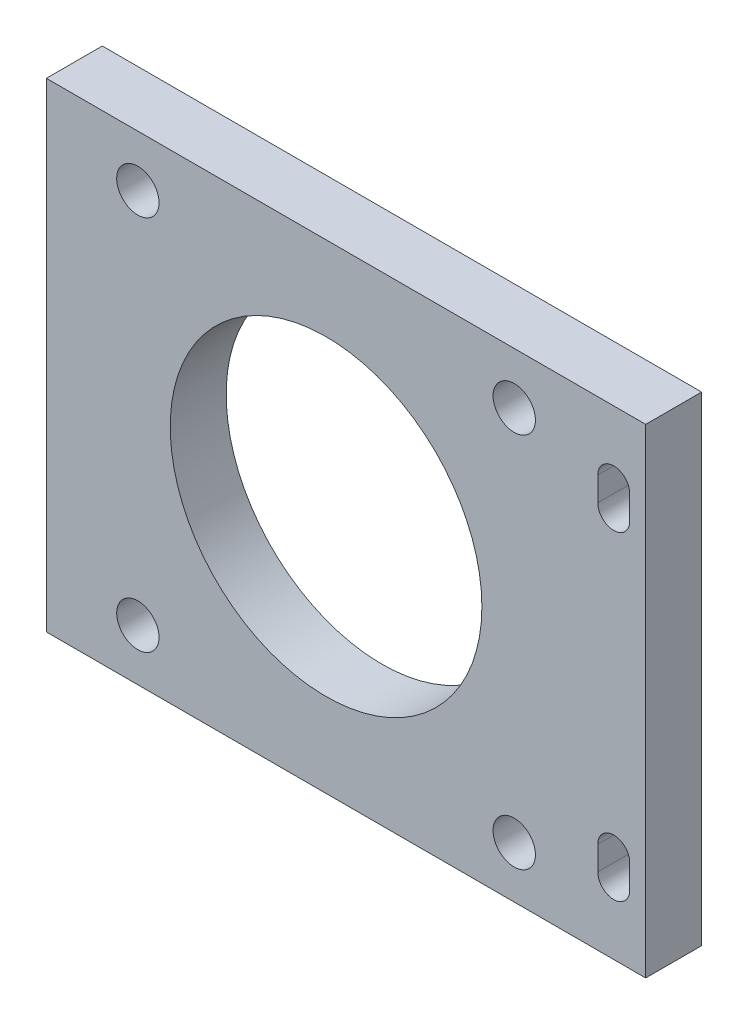
ISO-10303-21;
HEADER;
FILE_DESCRIPTION(('STEP AP214'),'2;1');
FILE_NAME('part.step','',(''),(''),'','','');
FILE_SCHEMA(('AUTOMOTIVE_DESIGN { 1 0 10303 214 1 1 1 1 }'));
ENDSEC;
DATA;
#1=APPLICATION_CONTEXT('core data for automotive mechanical design processes');
#2=APPLICATION_PROTOCOL_DEFINITION('international standard','automotive_design',2000,#1);
#3=PRODUCT_CONTEXT('',#1,'mechanical');
#4=PRODUCT('Part','Part','',(#3));
#5=PRODUCT_RELATED_PRODUCT_CATEGORY('part','',(#4));
#6=PRODUCT_DEFINITION_FORMATION('','',#4);
#7=PRODUCT_DEFINITION_CONTEXT('part definition',#1,'design');
#8=PRODUCT_DEFINITION('design','',#6,#7);
#9=PRODUCT_DEFINITION_SHAPE('','',#8);
#10=(LENGTH_UNIT() NAMED_UNIT(*) SI_UNIT(.MILLI.,.METRE.));
#11=(NAMED_UNIT(*) PLANE_ANGLE_UNIT() SI_UNIT($,.RADIAN.));
#12=(NAMED_UNIT(*) SI_UNIT($,.STERADIAN.) SOLID_ANGLE_UNIT());
#13=UNCERTAINTY_MEASURE_WITH_UNIT(LENGTH_MEASURE(1.E-05),#10,'distance_accuracy_value','');
#14=(GEOMETRIC_REPRESENTATION_CONTEXT(3) GLOBAL_UNCERTAINTY_ASSIGNED_CONTEXT((#13)) GLOBAL_UNIT_ASSIGNED_CONTEXT((#10,
#11,#12)) REPRESENTATION_CONTEXT('',''));
#15=CARTESIAN_POINT('',(0.,0.,0.));
#16=DIRECTION('',(0.,0.,1.));
#17=DIRECTION('',(1.,0.,0.));
#18=AXIS2_PLACEMENT_3D('',#15,#16,#17);
#19=CARTESIAN_POINT('',(-37.5,-30.,7.));
#20=DIRECTION('',(1.,0.,0.));
#21=DIRECTION('',(0.,0.,-1.));
#22=AXIS2_PLACEMENT_3D('',#19,#20,#21);
#23=PLANE('',#22);
#24=DIRECTION('',(0.,-1.,0.));
#25=VECTOR('',#24,1.);
#26=CARTESIAN_POINT('',(-37.5,-30.,0.));
#27=LINE('',#26,#25);
#28=CARTESIAN_POINT('',(-37.5,30.,0.));
#29=VERTEX_POINT('',#28);
#30=CARTESIAN_POINT('',(-37.5,-30.,0.));
#31=VERTEX_POINT('',#30);
#32=EDGE_CURVE('E219',#29,#31,#27,.T.);
#33=ORIENTED_EDGE('',*,*,#32,.T.);
#34=DIRECTION('',(0.,0.,-1.));
#35=VECTOR('',#34,1.);
#36=CARTESIAN_POINT('',(-37.5,-30.,7.));
#37=LINE('',#36,#35);
#38=CARTESIAN_POINT('',(-37.5,-30.,7.));
#39=VERTEX_POINT('',#38);
#40=EDGE_CURVE('E11',#39,#31,#37,.T.);
#41=ORIENTED_EDGE('',*,*,#40,.F.);
#42=DIRECTION('',(0.,-1.,0.));
#43=VECTOR('',#42,1.);
#44=CARTESIAN_POINT('',(-37.5,-30.,7.));
#45=LINE('',#44,#43);
#46=CARTESIAN_POINT('',(-37.5,30.,7.));
#47=VERTEX_POINT('',#46);
#48=EDGE_CURVE('E220',#47,#39,#45,.T.);
#49=ORIENTED_EDGE('',*,*,#48,.F.);
#50=DIRECTION('',(0.,0.,-1.));
#51=VECTOR('',#50,1.);
#52=CARTESIAN_POINT('',(-37.5,30.,7.));
#53=LINE('',#52,#51);
#54=EDGE_CURVE('E230',#47,#29,#53,.T.);
#55=ORIENTED_EDGE('',*,*,#54,.T.);
#56=EDGE_LOOP('',(#33,#41,#49,#55));
#57=FACE_BOUND('',#56,.T.);
#58=ADVANCED_FACE('F33',(#57),#23,.F.);
#59=CARTESIAN_POINT('',(37.5,-30.,7.));
#60=DIRECTION('',(0.,1.,0.));
#61=DIRECTION('',(-1.,0.,0.));
#62=AXIS2_PLACEMENT_3D('',#59,#60,#61);
#63=PLANE('',#62);
#64=DIRECTION('',(1.,0.,0.));
#65=VECTOR('',#64,1.);
#66=CARTESIAN_POINT('',(37.5,-30.,0.));
#67=LINE('',#66,#65);
#68=CARTESIAN_POINT('',(37.5,-30.,0.));
#69=VERTEX_POINT('',#68);
#70=EDGE_CURVE('E233',#31,#69,#67,.T.);
#71=ORIENTED_EDGE('',*,*,#70,.T.);
#72=DIRECTION('',(0.,0.,-1.));
#73=VECTOR('',#72,1.);
#74=CARTESIAN_POINT('',(37.5,-30.,7.));
#75=LINE('',#74,#73);
#76=CARTESIAN_POINT('',(37.5,-30.,7.));
#77=VERTEX_POINT('',#76);
#78=EDGE_CURVE('E40',#77,#69,#75,.T.);
#79=ORIENTED_EDGE('',*,*,#78,.F.);
#80=DIRECTION('',(1.,0.,0.));
#81=VECTOR('',#80,1.);
#82=CARTESIAN_POINT('',(37.5,-30.,7.));
#83=LINE('',#82,#81);
#84=EDGE_CURVE('E223',#39,#77,#83,.T.);
#85=ORIENTED_EDGE('',*,*,#84,.F.);
#86=ORIENTED_EDGE('',*,*,#40,.T.);
#87=EDGE_LOOP('',(#71,#79,#85,#86));
#88=FACE_BOUND('',#87,.T.);
#89=ADVANCED_FACE('F262',(#88),#63,.F.);
#90=CARTESIAN_POINT('',(37.5,-30.,7.));
#91=DIRECTION('',(-1.,0.,0.));
#92=DIRECTION('',(0.,0.,1.));
#93=AXIS2_PLACEMENT_3D('',#90,#91,#92);
#94=PLANE('',#93);
#95=DIRECTION('',(0.,1.,0.));
#96=VECTOR('',#95,1.);
#97=CARTESIAN_POINT('',(37.5,-30.,0.));
#98=LINE('',#97,#96);
#99=CARTESIAN_POINT('',(37.5,30.,0.));
#100=VERTEX_POINT('',#99);
#101=EDGE_CURVE('E235',#69,#100,#98,.T.);
#102=ORIENTED_EDGE('',*,*,#101,.T.);
#103=DIRECTION('',(0.,0.,-1.));
#104=VECTOR('',#103,1.);
#105=CARTESIAN_POINT('',(37.5,30.,7.));
#106=LINE('',#105,#104);
#107=CARTESIAN_POINT('',(37.5,30.,7.));
#108=VERTEX_POINT('',#107);
#109=EDGE_CURVE('E240',#108,#100,#106,.T.);
#110=ORIENTED_EDGE('',*,*,#109,.F.);
#111=DIRECTION('',(0.,1.,0.));
#112=VECTOR('',#111,1.);
#113=CARTESIAN_POINT('',(37.5,-30.,7.));
#114=LINE('',#113,#112);
#115=EDGE_CURVE('E226',#77,#108,#114,.T.);
#116=ORIENTED_EDGE('',*,*,#115,.F.);
#117=ORIENTED_EDGE('',*,*,#78,.T.);
#118=EDGE_LOOP('',(#102,#110,#116,#117));
#119=FACE_BOUND('',#118,.T.);
#120=ADVANCED_FACE('F247',(#119),#94,.F.);
#121=CARTESIAN_POINT('',(37.5,30.,7.));
#122=DIRECTION('',(0.,-1.,0.));
#123=DIRECTION('',(1.,0.,0.));
#124=AXIS2_PLACEMENT_3D('',#121,#122,#123);
#125=PLANE('',#124);
#126=DIRECTION('',(-1.,0.,0.));
#127=VECTOR('',#126,1.);
#128=CARTESIAN_POINT('',(37.5,30.,0.));
#129=LINE('',#128,#127);
#130=EDGE_CURVE('E224',#100,#29,#129,.T.);
#131=ORIENTED_EDGE('',*,*,#130,.T.);
#132=ORIENTED_EDGE('',*,*,#54,.F.);
#133=DIRECTION('',(-1.,0.,0.));
#134=VECTOR('',#133,1.);
#135=CARTESIAN_POINT('',(37.5,30.,7.));
#136=LINE('',#135,#134);
#137=EDGE_CURVE('E228',#108,#47,#136,.T.);
#138=ORIENTED_EDGE('',*,*,#137,.F.);
#139=ORIENTED_EDGE('',*,*,#109,.T.);
#140=EDGE_LOOP('',(#131,#132,#138,#139));
#141=FACE_BOUND('',#140,.T.);
#142=ADVANCED_FACE('F256',(#141),#125,.F.);
#143=CARTESIAN_POINT('',(0.,0.,7.));
#144=DIRECTION('',(0.,0.,1.));
#145=DIRECTION('',(1.,0.,0.));
#146=AXIS2_PLACEMENT_3D('',#143,#144,#145);
#147=PLANE('',#146);
#148=CARTESIAN_POINT('',(33.5,-18.5,7.));
#149=DIRECTION('',(0.,0.,-1.));
#150=DIRECTION('',(1.,0.,0.));
#151=AXIS2_PLACEMENT_3D('',#148,#149,#150);
#152=CIRCLE('',#151,2.);
#153=CARTESIAN_POINT('',(31.5,-18.5,7.));
#154=VERTEX_POINT('',#153);
#155=CARTESIAN_POINT('',(35.5,-18.5,7.));
#156=VERTEX_POINT('',#155);
#157=EDGE_CURVE('E123',#154,#156,#152,.T.);
#158=ORIENTED_EDGE('',*,*,#157,.T.);
#159=DIRECTION('',(0.,-1.,0.));
#160=VECTOR('',#159,1.);
#161=CARTESIAN_POINT('',(35.5,-18.5,7.));
#162=LINE('',#161,#160);
#163=CARTESIAN_POINT('',(35.5,-21.5,7.));
#164=VERTEX_POINT('',#163);
#165=EDGE_CURVE('E132',#156,#164,#162,.T.);
#166=ORIENTED_EDGE('',*,*,#165,.T.);
#167=CARTESIAN_POINT('',(33.5,-21.5,7.));
#168=DIRECTION('',(0.,0.,-1.));
#169=DIRECTION('',(1.,0.,0.));
#170=AXIS2_PLACEMENT_3D('',#167,#168,#169);
#171=CIRCLE('',#170,2.);
#172=CARTESIAN_POINT('',(31.5,-21.5,7.));
#173=VERTEX_POINT('',#172);
#174=EDGE_CURVE('E47',#164,#173,#171,.T.);
#175=ORIENTED_EDGE('',*,*,#174,.T.);
#176=DIRECTION('',(0.,1.,0.));
#177=VECTOR('',#176,1.);
#178=CARTESIAN_POINT('',(31.5,-18.5,7.));
#179=LINE('',#178,#177);
#180=EDGE_CURVE('E129',#173,#154,#179,.T.);
#181=ORIENTED_EDGE('',*,*,#180,.T.);
#182=EDGE_LOOP('',(#158,#166,#175,#181));
#183=FACE_BOUND('',#182,.T.);
#184=CARTESIAN_POINT('',(33.5,18.5,7.));
#185=DIRECTION('',(0.,0.,-1.));
#186=DIRECTION('',(-1.,0.,0.));
#187=AXIS2_PLACEMENT_3D('',#184,#185,#186);
#188=CIRCLE('',#187,2.);
#189=CARTESIAN_POINT('',(35.5,18.5,7.));
#190=VERTEX_POINT('',#189);
#191=CARTESIAN_POINT('',(31.5,18.5,7.));
#192=VERTEX_POINT('',#191);
#193=EDGE_CURVE('E158',#190,#192,#188,.T.);
#194=ORIENTED_EDGE('',*,*,#193,.T.);
#195=DIRECTION('',(0.,1.,0.));
#196=VECTOR('',#195,1.);
#197=CARTESIAN_POINT('',(31.5,18.5,7.));
#198=LINE('',#197,#196);
#199=CARTESIAN_POINT('',(31.5,21.5,7.));
#200=VERTEX_POINT('',#199);
#201=EDGE_CURVE('E161',#192,#200,#198,.T.);
#202=ORIENTED_EDGE('',*,*,#201,.T.);
#203=CARTESIAN_POINT('',(33.5,21.5,7.));
#204=DIRECTION('',(0.,0.,-1.));
#205=DIRECTION('',(-1.,0.,0.));
#206=AXIS2_PLACEMENT_3D('',#203,#204,#205);
#207=CIRCLE('',#206,2.);
#208=CARTESIAN_POINT('',(35.5,21.5,7.));
#209=VERTEX_POINT('',#208);
#210=EDGE_CURVE('E165',#200,#209,#207,.T.);
#211=ORIENTED_EDGE('',*,*,#210,.T.);
#212=DIRECTION('',(0.,-1.,0.));
#213=VECTOR('',#212,1.);
#214=CARTESIAN_POINT('',(35.5,18.5,7.));
#215=LINE('',#214,#213);
#216=EDGE_CURVE('E168',#209,#190,#215,.T.);
#217=ORIENTED_EDGE('',*,*,#216,.T.);
#218=EDGE_LOOP('',(#194,#202,#211,#217));
#219=FACE_BOUND('',#218,.T.);
#220=CARTESIAN_POINT('',(-2.5,0.,7.));
#221=DIRECTION('',(0.,0.,1.));
#222=DIRECTION('',(1.,0.,0.));
#223=AXIS2_PLACEMENT_3D('',#220,#221,#222);
#224=CIRCLE('',#223,19.5);
#225=CARTESIAN_POINT('',(17.,0.,7.));
#226=VERTEX_POINT('',#225);
#227=EDGE_CURVE('E183',#226,#226,#224,.T.);
#228=ORIENTED_EDGE('',*,*,#227,.F.);
#229=EDGE_LOOP('',(#228));
#230=FACE_BOUND('',#229,.T.);
#231=CARTESIAN_POINT('',(21.05,23.55,7.));
#232=DIRECTION('',(0.,0.,-1.));
#233=DIRECTION('',(-1.,0.,0.));
#234=AXIS2_PLACEMENT_3D('',#231,#232,#233);
#235=CIRCLE('',#234,2.65);
#236=CARTESIAN_POINT('',(18.4,23.55,7.));
#237=VERTEX_POINT('',#236);
#238=EDGE_CURVE('E198',#237,#237,#235,.T.);
#239=ORIENTED_EDGE('',*,*,#238,.T.);
#240=EDGE_LOOP('',(#239));
#241=FACE_BOUND('',#240,.T.);
#242=CARTESIAN_POINT('',(-26.05,23.55,7.));
#243=DIRECTION('',(0.,0.,-1.));
#244=DIRECTION('',(-1.,0.,0.));
#245=AXIS2_PLACEMENT_3D('',#242,#243,#244);
#246=CIRCLE('',#245,2.65);
#247=CARTESIAN_POINT('',(-28.7,23.55,7.));
#248=VERTEX_POINT('',#247);
#249=EDGE_CURVE('E204',#248,#248,#246,.T.);
#250=ORIENTED_EDGE('',*,*,#249,.T.);
#251=EDGE_LOOP('',(#250));
#252=FACE_BOUND('',#251,.T.);
#253=CARTESIAN_POINT('',(-26.05,-23.55,7.));
#254=DIRECTION('',(0.,0.,-1.));
#255=DIRECTION('',(-1.,0.,0.));
#256=AXIS2_PLACEMENT_3D('',#253,#254,#255);
#257=CIRCLE('',#256,2.65);
#258=CARTESIAN_POINT('',(-28.7,-23.55,7.));
#259=VERTEX_POINT('',#258);
#260=EDGE_CURVE('E210',#259,#259,#257,.T.);
#261=ORIENTED_EDGE('',*,*,#260,.T.);
#262=EDGE_LOOP('',(#261));
#263=FACE_BOUND('',#262,.T.);
#264=CARTESIAN_POINT('',(21.05,-23.55,7.));
#265=DIRECTION('',(0.,0.,-1.));
#266=DIRECTION('',(-1.,0.,0.));
#267=AXIS2_PLACEMENT_3D('',#264,#265,#266);
#268=CIRCLE('',#267,2.65);
#269=CARTESIAN_POINT('',(18.4,-23.55,7.));
#270=VERTEX_POINT('',#269);
#271=EDGE_CURVE('E216',#270,#270,#268,.T.);
#272=ORIENTED_EDGE('',*,*,#271,.T.);
#273=EDGE_LOOP('',(#272));
#274=FACE_BOUND('',#273,.T.);
#275=ORIENTED_EDGE('',*,*,#48,.T.);
#276=ORIENTED_EDGE('',*,*,#84,.T.);
#277=ORIENTED_EDGE('',*,*,#115,.T.);
#278=ORIENTED_EDGE('',*,*,#137,.T.);
#279=EDGE_LOOP('',(#275,#276,#277,#278));
#280=FACE_BOUND('',#279,.T.);
#281=ADVANCED_FACE('F136',(#183,#219,#230,#241,#252,#263,#274,#280),#147,.T.);
#282=CARTESIAN_POINT('',(0.,0.,0.));
#283=DIRECTION('',(0.,0.,1.));
#284=DIRECTION('',(1.,0.,0.));
#285=AXIS2_PLACEMENT_3D('',#282,#283,#284);
#286=PLANE('',#285);
#287=DIRECTION('',(0.,-1.,0.));
#288=VECTOR('',#287,1.);
#289=CARTESIAN_POINT('',(35.5,-18.5,0.));
#290=LINE('',#289,#288);
#291=CARTESIAN_POINT('',(35.5,-18.5,0.));
#292=VERTEX_POINT('',#291);
#293=CARTESIAN_POINT('',(35.5,-21.5,0.));
#294=VERTEX_POINT('',#293);
#295=EDGE_CURVE('E148',#292,#294,#290,.T.);
#296=ORIENTED_EDGE('',*,*,#295,.F.);
#297=CARTESIAN_POINT('',(33.5,-18.5,0.));
#298=DIRECTION('',(0.,0.,-1.));
#299=DIRECTION('',(1.,0.,0.));
#300=AXIS2_PLACEMENT_3D('',#297,#298,#299);
#301=CIRCLE('',#300,2.);
#302=CARTESIAN_POINT('',(31.5,-18.5,0.));
#303=VERTEX_POINT('',#302);
#304=EDGE_CURVE('E55',#303,#292,#301,.T.);
#305=ORIENTED_EDGE('',*,*,#304,.F.);
#306=DIRECTION('',(0.,1.,0.));
#307=VECTOR('',#306,1.);
#308=CARTESIAN_POINT('',(31.5,-18.5,0.));
#309=LINE('',#308,#307);
#310=CARTESIAN_POINT('',(31.5,-21.5,0.));
#311=VERTEX_POINT('',#310);
#312=EDGE_CURVE('E139',#311,#303,#309,.T.);
#313=ORIENTED_EDGE('',*,*,#312,.F.);
#314=CARTESIAN_POINT('',(33.5,-21.5,0.));
#315=DIRECTION('',(0.,0.,-1.));
#316=DIRECTION('',(1.,0.,0.));
#317=AXIS2_PLACEMENT_3D('',#314,#315,#316);
#318=CIRCLE('',#317,2.);
#319=EDGE_CURVE('E142',#294,#311,#318,.T.);
#320=ORIENTED_EDGE('',*,*,#319,.F.);
#321=EDGE_LOOP('',(#296,#305,#313,#320));
#322=FACE_BOUND('',#321,.T.);
#323=DIRECTION('',(0.,1.,0.));
#324=VECTOR('',#323,1.);
#325=CARTESIAN_POINT('',(31.5,18.5,0.));
#326=LINE('',#325,#324);
#327=CARTESIAN_POINT('',(31.5,18.5,0.));
#328=VERTEX_POINT('',#327);
#329=CARTESIAN_POINT('',(31.5,21.5,0.));
#330=VERTEX_POINT('',#329);
#331=EDGE_CURVE('E173',#328,#330,#326,.T.);
#332=ORIENTED_EDGE('',*,*,#331,.F.);
#333=CARTESIAN_POINT('',(33.5,18.5,0.));
#334=DIRECTION('',(0.,0.,-1.));
#335=DIRECTION('',(-1.,0.,0.));
#336=AXIS2_PLACEMENT_3D('',#333,#334,#335);
#337=CIRCLE('',#336,2.);
#338=CARTESIAN_POINT('',(35.5,18.5,0.));
#339=VERTEX_POINT('',#338);
#340=EDGE_CURVE('E154',#339,#328,#337,.T.);
#341=ORIENTED_EDGE('',*,*,#340,.F.);
#342=DIRECTION('',(0.,-1.,0.));
#343=VECTOR('',#342,1.);
#344=CARTESIAN_POINT('',(35.5,18.5,0.));
#345=LINE('',#344,#343);
#346=CARTESIAN_POINT('',(35.5,21.5,0.));
#347=VERTEX_POINT('',#346);
#348=EDGE_CURVE('E162',#347,#339,#345,.T.);
#349=ORIENTED_EDGE('',*,*,#348,.F.);
#350=CARTESIAN_POINT('',(33.5,21.5,0.));
#351=DIRECTION('',(0.,0.,-1.));
#352=DIRECTION('',(-1.,0.,0.));
#353=AXIS2_PLACEMENT_3D('',#350,#351,#352);
#354=CIRCLE('',#353,2.);
#355=EDGE_CURVE('E176',#330,#347,#354,.T.);
#356=ORIENTED_EDGE('',*,*,#355,.F.);
#357=EDGE_LOOP('',(#332,#341,#349,#356));
#358=FACE_BOUND('',#357,.T.);
#359=CARTESIAN_POINT('',(-2.5,0.,0.));
#360=DIRECTION('',(0.,0.,1.));
#361=DIRECTION('',(1.,0.,0.));
#362=AXIS2_PLACEMENT_3D('',#359,#360,#361);
#363=CIRCLE('',#362,19.5);
#364=CARTESIAN_POINT('',(17.,0.,0.));
#365=VERTEX_POINT('',#364);
#366=EDGE_CURVE('E190',#365,#365,#363,.T.);
#367=ORIENTED_EDGE('',*,*,#366,.T.);
#368=EDGE_LOOP('',(#367));
#369=FACE_BOUND('',#368,.T.);
#370=CARTESIAN_POINT('',(21.05,23.55,0.));
#371=DIRECTION('',(0.,0.,-1.));
#372=DIRECTION('',(-1.,0.,0.));
#373=AXIS2_PLACEMENT_3D('',#370,#371,#372);
#374=CIRCLE('',#373,2.65);
#375=CARTESIAN_POINT('',(18.4,23.55,0.));
#376=VERTEX_POINT('',#375);
#377=EDGE_CURVE('E193',#376,#376,#374,.T.);
#378=ORIENTED_EDGE('',*,*,#377,.F.);
#379=EDGE_LOOP('',(#378));
#380=FACE_BOUND('',#379,.T.);
#381=CARTESIAN_POINT('',(-26.05,23.55,0.));
#382=DIRECTION('',(0.,0.,-1.));
#383=DIRECTION('',(-1.,0.,0.));
#384=AXIS2_PLACEMENT_3D('',#381,#382,#383);
#385=CIRCLE('',#384,2.65);
#386=CARTESIAN_POINT('',(-28.7,23.55,0.));
#387=VERTEX_POINT('',#386);
#388=EDGE_CURVE('E201',#387,#387,#385,.T.);
#389=ORIENTED_EDGE('',*,*,#388,.F.);
#390=EDGE_LOOP('',(#389));
#391=FACE_BOUND('',#390,.T.);
#392=CARTESIAN_POINT('',(-26.05,-23.55,0.));
#393=DIRECTION('',(0.,0.,-1.));
#394=DIRECTION('',(-1.,0.,0.));
#395=AXIS2_PLACEMENT_3D('',#392,#393,#394);
#396=CIRCLE('',#395,2.65);
#397=CARTESIAN_POINT('',(-28.7,-23.55,0.));
#398=VERTEX_POINT('',#397);
#399=EDGE_CURVE('E207',#398,#398,#396,.T.);
#400=ORIENTED_EDGE('',*,*,#399,.F.);
#401=EDGE_LOOP('',(#400));
#402=FACE_BOUND('',#401,.T.);
#403=CARTESIAN_POINT('',(21.05,-23.55,0.));
#404=DIRECTION('',(0.,0.,-1.));
#405=DIRECTION('',(-1.,0.,0.));
#406=AXIS2_PLACEMENT_3D('',#403,#404,#405);
#407=CIRCLE('',#406,2.65);
#408=CARTESIAN_POINT('',(18.4,-23.55,0.));
#409=VERTEX_POINT('',#408);
#410=EDGE_CURVE('E213',#409,#409,#407,.T.);
#411=ORIENTED_EDGE('',*,*,#410,.F.);
#412=EDGE_LOOP('',(#411));
#413=FACE_BOUND('',#412,.T.);
#414=ORIENTED_EDGE('',*,*,#32,.F.);
#415=ORIENTED_EDGE('',*,*,#130,.F.);
#416=ORIENTED_EDGE('',*,*,#101,.F.);
#417=ORIENTED_EDGE('',*,*,#70,.F.);
#418=EDGE_LOOP('',(#414,#415,#416,#417));
#419=FACE_BOUND('',#418,.T.);
#420=ADVANCED_FACE('F253',(#322,#358,#369,#380,#391,#402,#413,#419),#286,.F.);
#421=CARTESIAN_POINT('',(21.05,-23.55,0.));
#422=DIRECTION('',(0.,0.,-1.));
#423=DIRECTION('',(-1.,0.,0.));
#424=AXIS2_PLACEMENT_3D('',#421,#422,#423);
#425=CYLINDRICAL_SURFACE('',#424,2.65);
#426=ORIENTED_EDGE('',*,*,#271,.F.);
#427=EDGE_LOOP('',(#426));
#428=FACE_BOUND('',#427,.T.);
#429=ORIENTED_EDGE('',*,*,#410,.T.);
#430=EDGE_LOOP('',(#429));
#431=FACE_BOUND('',#430,.T.);
#432=ADVANCED_FACE('F274',(#428,#431),#425,.F.);
#433=CARTESIAN_POINT('',(-26.05,-23.55,0.));
#434=DIRECTION('',(0.,0.,-1.));
#435=DIRECTION('',(-1.,0.,0.));
#436=AXIS2_PLACEMENT_3D('',#433,#434,#435);
#437=CYLINDRICAL_SURFACE('',#436,2.65);
#438=ORIENTED_EDGE('',*,*,#260,.F.);
#439=EDGE_LOOP('',(#438));
#440=FACE_BOUND('',#439,.T.);
#441=ORIENTED_EDGE('',*,*,#399,.T.);
#442=EDGE_LOOP('',(#441));
#443=FACE_BOUND('',#442,.T.);
#444=ADVANCED_FACE('F280',(#440,#443),#437,.F.);
#445=CARTESIAN_POINT('',(-26.05,23.55,0.));
#446=DIRECTION('',(0.,0.,-1.));
#447=DIRECTION('',(-1.,0.,0.));
#448=AXIS2_PLACEMENT_3D('',#445,#446,#447);
#449=CYLINDRICAL_SURFACE('',#448,2.65);
#450=ORIENTED_EDGE('',*,*,#249,.F.);
#451=EDGE_LOOP('',(#450));
#452=FACE_BOUND('',#451,.T.);
#453=ORIENTED_EDGE('',*,*,#388,.T.);
#454=EDGE_LOOP('',(#453));
#455=FACE_BOUND('',#454,.T.);
#456=ADVANCED_FACE('F284',(#452,#455),#449,.F.);
#457=CARTESIAN_POINT('',(21.05,23.55,0.));
#458=DIRECTION('',(0.,0.,-1.));
#459=DIRECTION('',(-1.,0.,0.));
#460=AXIS2_PLACEMENT_3D('',#457,#458,#459);
#461=CYLINDRICAL_SURFACE('',#460,2.65);
#462=ORIENTED_EDGE('',*,*,#238,.F.);
#463=EDGE_LOOP('',(#462));
#464=FACE_BOUND('',#463,.T.);
#465=ORIENTED_EDGE('',*,*,#377,.T.);
#466=EDGE_LOOP('',(#465));
#467=FACE_BOUND('',#466,.T.);
#468=ADVANCED_FACE('F288',(#464,#467),#461,.F.);
#469=CARTESIAN_POINT('',(-2.5,0.,0.));
#470=DIRECTION('',(0.,0.,1.));
#471=DIRECTION('',(1.,0.,0.));
#472=AXIS2_PLACEMENT_3D('',#469,#470,#471);
#473=CYLINDRICAL_SURFACE('',#472,19.5);
#474=ORIENTED_EDGE('',*,*,#366,.F.);
#475=EDGE_LOOP('',(#474));
#476=FACE_BOUND('',#475,.T.);
#477=ORIENTED_EDGE('',*,*,#227,.T.);
#478=EDGE_LOOP('',(#477));
#479=FACE_BOUND('',#478,.T.);
#480=ADVANCED_FACE('F292',(#476,#479),#473,.F.);
#481=CARTESIAN_POINT('',(33.5,18.5,7.));
#482=DIRECTION('',(0.,0.,-1.));
#483=DIRECTION('',(-1.,0.,0.));
#484=AXIS2_PLACEMENT_3D('',#481,#482,#483);
#485=CYLINDRICAL_SURFACE('',#484,2.);
#486=ORIENTED_EDGE('',*,*,#340,.T.);
#487=DIRECTION('',(0.,0.,-1.));
#488=VECTOR('',#487,1.);
#489=CARTESIAN_POINT('',(31.5,18.5,7.));
#490=LINE('',#489,#488);
#491=EDGE_CURVE('E171',#192,#328,#490,.T.);
#492=ORIENTED_EDGE('',*,*,#491,.F.);
#493=ORIENTED_EDGE('',*,*,#193,.F.);
#494=DIRECTION('',(0.,0.,-1.));
#495=VECTOR('',#494,1.);
#496=CARTESIAN_POINT('',(35.5,18.5,7.));
#497=LINE('',#496,#495);
#498=EDGE_CURVE('E181',#190,#339,#497,.T.);
#499=ORIENTED_EDGE('',*,*,#498,.T.);
#500=EDGE_LOOP('',(#486,#492,#493,#499));
#501=FACE_BOUND('',#500,.T.);
#502=ADVANCED_FACE('F296',(#501),#485,.F.);
#503=CARTESIAN_POINT('',(35.5,18.5,7.));
#504=DIRECTION('',(1.,0.,0.));
#505=DIRECTION('',(0.,0.,-1.));
#506=AXIS2_PLACEMENT_3D('',#503,#504,#505);
#507=PLANE('',#506);
#508=ORIENTED_EDGE('',*,*,#348,.T.);
#509=ORIENTED_EDGE('',*,*,#498,.F.);
#510=ORIENTED_EDGE('',*,*,#216,.F.);
#511=DIRECTION('',(0.,0.,-1.));
#512=VECTOR('',#511,1.);
#513=CARTESIAN_POINT('',(35.5,21.5,7.));
#514=LINE('',#513,#512);
#515=EDGE_CURVE('E184',#209,#347,#514,.T.);
#516=ORIENTED_EDGE('',*,*,#515,.T.);
#517=EDGE_LOOP('',(#508,#509,#510,#516));
#518=FACE_BOUND('',#517,.T.);
#519=ADVANCED_FACE('F300',(#518),#507,.F.);
#520=CARTESIAN_POINT('',(33.5,21.5,7.));
#521=DIRECTION('',(0.,0.,-1.));
#522=DIRECTION('',(-1.,0.,0.));
#523=AXIS2_PLACEMENT_3D('',#520,#521,#522);
#524=CYLINDRICAL_SURFACE('',#523,2.);
#525=ORIENTED_EDGE('',*,*,#355,.T.);
#526=ORIENTED_EDGE('',*,*,#515,.F.);
#527=ORIENTED_EDGE('',*,*,#210,.F.);
#528=DIRECTION('',(0.,0.,-1.));
#529=VECTOR('',#528,1.);
#530=CARTESIAN_POINT('',(31.5,21.5,7.));
#531=LINE('',#530,#529);
#532=EDGE_CURVE('E186',#200,#330,#531,.T.);
#533=ORIENTED_EDGE('',*,*,#532,.T.);
#534=EDGE_LOOP('',(#525,#526,#527,#533));
#535=FACE_BOUND('',#534,.T.);
#536=ADVANCED_FACE('F305',(#535),#524,.F.);
#537=CARTESIAN_POINT('',(31.5,18.5,7.));
#538=DIRECTION('',(-1.,0.,0.));
#539=DIRECTION('',(0.,0.,1.));
#540=AXIS2_PLACEMENT_3D('',#537,#538,#539);
#541=PLANE('',#540);
#542=ORIENTED_EDGE('',*,*,#331,.T.);
#543=ORIENTED_EDGE('',*,*,#532,.F.);
#544=ORIENTED_EDGE('',*,*,#201,.F.);
#545=ORIENTED_EDGE('',*,*,#491,.T.);
#546=EDGE_LOOP('',(#542,#543,#544,#545));
#547=FACE_BOUND('',#546,.T.);
#548=ADVANCED_FACE('F302',(#547),#541,.F.);
#549=CARTESIAN_POINT('',(33.5,-18.5,7.));
#550=DIRECTION('',(0.,0.,-1.));
#551=DIRECTION('',(-1.,0.,0.));
#552=AXIS2_PLACEMENT_3D('',#549,#550,#551);
#553=CYLINDRICAL_SURFACE('',#552,2.);
#554=ORIENTED_EDGE('',*,*,#304,.T.);
#555=DIRECTION('',(0.,0.,-1.));
#556=VECTOR('',#555,1.);
#557=CARTESIAN_POINT('',(35.5,-18.5,7.));
#558=LINE('',#557,#556);
#559=EDGE_CURVE('E119',#156,#292,#558,.T.);
#560=ORIENTED_EDGE('',*,*,#559,.F.);
#561=ORIENTED_EDGE('',*,*,#157,.F.);
#562=DIRECTION('',(0.,0.,-1.));
#563=VECTOR('',#562,1.);
#564=CARTESIAN_POINT('',(31.5,-18.5,7.));
#565=LINE('',#564,#563);
#566=EDGE_CURVE('E152',#154,#303,#565,.T.);
#567=ORIENTED_EDGE('',*,*,#566,.T.);
#568=EDGE_LOOP('',(#554,#560,#561,#567));
#569=FACE_BOUND('',#568,.T.);
#570=ADVANCED_FACE('F121',(#569),#553,.F.);
#571=CARTESIAN_POINT('',(31.5,-18.5,7.));
#572=DIRECTION('',(-1.,0.,0.));
#573=DIRECTION('',(0.,0.,1.));
#574=AXIS2_PLACEMENT_3D('',#571,#572,#573);
#575=PLANE('',#574);
#576=ORIENTED_EDGE('',*,*,#312,.T.);
#577=ORIENTED_EDGE('',*,*,#566,.F.);
#578=ORIENTED_EDGE('',*,*,#180,.F.);
#579=DIRECTION('',(0.,0.,-1.));
#580=VECTOR('',#579,1.);
#581=CARTESIAN_POINT('',(31.5,-21.5,7.));
#582=LINE('',#581,#580);
#583=EDGE_CURVE('E155',#173,#311,#582,.T.);
#584=ORIENTED_EDGE('',*,*,#583,.T.);
#585=EDGE_LOOP('',(#576,#577,#578,#584));
#586=FACE_BOUND('',#585,.T.);
#587=ADVANCED_FACE('F315',(#586),#575,.F.);
#588=CARTESIAN_POINT('',(33.5,-21.5,7.));
#589=DIRECTION('',(0.,0.,-1.));
#590=DIRECTION('',(-1.,0.,0.));
#591=AXIS2_PLACEMENT_3D('',#588,#589,#590);
#592=CYLINDRICAL_SURFACE('',#591,2.);
#593=ORIENTED_EDGE('',*,*,#319,.T.);
#594=ORIENTED_EDGE('',*,*,#583,.F.);
#595=ORIENTED_EDGE('',*,*,#174,.F.);
#596=DIRECTION('',(0.,0.,-1.));
#597=VECTOR('',#596,1.);
#598=CARTESIAN_POINT('',(35.5,-21.5,7.));
#599=LINE('',#598,#597);
#600=EDGE_CURVE('E128',#164,#294,#599,.T.);
#601=ORIENTED_EDGE('',*,*,#600,.T.);
#602=EDGE_LOOP('',(#593,#594,#595,#601));
#603=FACE_BOUND('',#602,.T.);
#604=ADVANCED_FACE('F318',(#603),#592,.F.);
#605=CARTESIAN_POINT('',(35.5,-18.5,7.));
#606=DIRECTION('',(1.,0.,0.));
#607=DIRECTION('',(0.,0.,-1.));
#608=AXIS2_PLACEMENT_3D('',#605,#606,#607);
#609=PLANE('',#608);
#610=ORIENTED_EDGE('',*,*,#295,.T.);
#611=ORIENTED_EDGE('',*,*,#600,.F.);
#612=ORIENTED_EDGE('',*,*,#165,.F.);
#613=ORIENTED_EDGE('',*,*,#559,.T.);
#614=EDGE_LOOP('',(#610,#611,#612,#613));
#615=FACE_BOUND('',#614,.T.);
#616=ADVANCED_FACE('F133',(#615),#609,.F.);
#617=CLOSED_SHELL('',(#58,#89,#120,#142,#281,#420,#432,#444,#456,#468,#480,#502,#519,#536,#548,
#570,#587,#604,#616));
#618=MANIFOLD_SOLID_BREP('B2',#617);
#619=ADVANCED_BREP_SHAPE_REPRESENTATION('',(#18,#618),#14);
#620=SHAPE_DEFINITION_REPRESENTATION(#9,#619);
ENDSEC;
END-ISO-10303-21;
